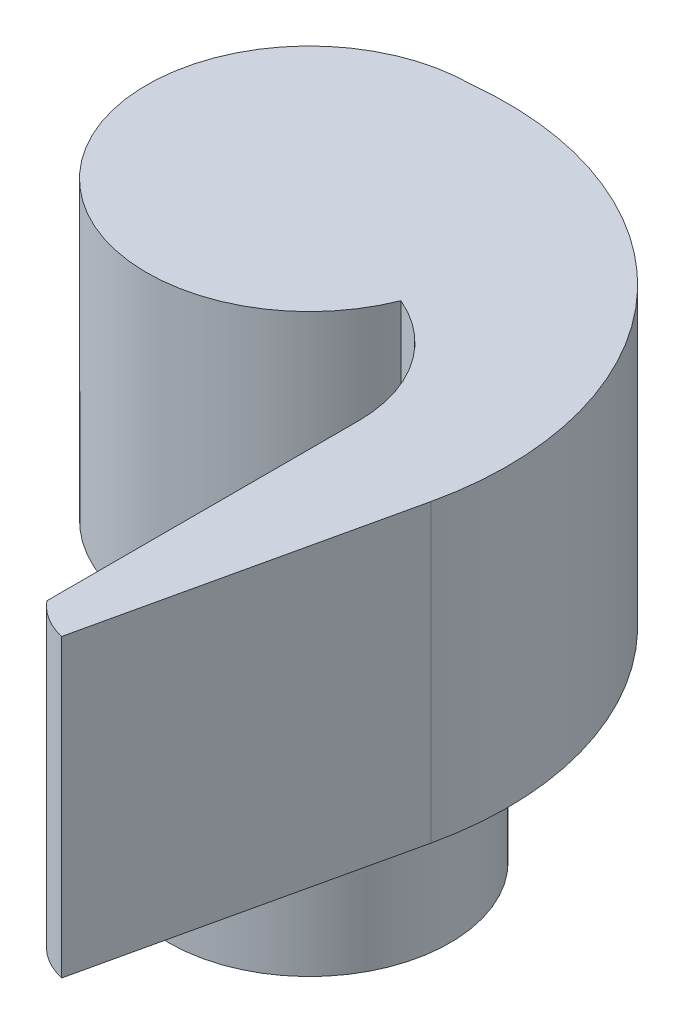
ISO-10303-21;
HEADER;
FILE_DESCRIPTION(('STEP AP214'),'2;1');
FILE_NAME('part.step','',(''),(''),'','','');
FILE_SCHEMA(('AUTOMOTIVE_DESIGN { 1 0 10303 214 1 1 1 1 }'));
ENDSEC;
DATA;
#1=APPLICATION_CONTEXT('core data for automotive mechanical design processes');
#2=APPLICATION_PROTOCOL_DEFINITION('international standard','automotive_design',2000,#1);
#3=PRODUCT_CONTEXT('',#1,'mechanical');
#4=PRODUCT('Part','Part','',(#3));
#5=PRODUCT_RELATED_PRODUCT_CATEGORY('part','',(#4));
#6=PRODUCT_DEFINITION_FORMATION('','',#4);
#7=PRODUCT_DEFINITION_CONTEXT('part definition',#1,'design');
#8=PRODUCT_DEFINITION('design','',#6,#7);
#9=PRODUCT_DEFINITION_SHAPE('','',#8);
#10=(LENGTH_UNIT() NAMED_UNIT(*) SI_UNIT(.MILLI.,.METRE.));
#11=(NAMED_UNIT(*) PLANE_ANGLE_UNIT() SI_UNIT($,.RADIAN.));
#12=(NAMED_UNIT(*) SI_UNIT($,.STERADIAN.) SOLID_ANGLE_UNIT());
#13=UNCERTAINTY_MEASURE_WITH_UNIT(LENGTH_MEASURE(1.E-05),#10,'distance_accuracy_value','');
#14=(GEOMETRIC_REPRESENTATION_CONTEXT(3) GLOBAL_UNCERTAINTY_ASSIGNED_CONTEXT((#13)) GLOBAL_UNIT_ASSIGNED_CONTEXT((#10,
#11,#12)) REPRESENTATION_CONTEXT('',''));
#15=CARTESIAN_POINT('',(0.,0.,0.));
#16=DIRECTION('',(0.,0.,1.));
#17=DIRECTION('',(1.,0.,0.));
#18=AXIS2_PLACEMENT_3D('',#15,#16,#17);
#19=CARTESIAN_POINT('',(19.4578777462422,20.,30.5814100525998));
#20=DIRECTION('',(0.,-1.,0.));
#21=DIRECTION('',(0.,0.,-1.));
#22=AXIS2_PLACEMENT_3D('',#19,#20,#21);
#23=CYLINDRICAL_SURFACE('',#22,4.71068136707812);
#24=CARTESIAN_POINT('',(19.4578777462422,0.,30.5814100525998));
#25=DIRECTION('',(0.,1.,0.));
#26=DIRECTION('',(0.,0.,-1.));
#27=AXIS2_PLACEMENT_3D('',#24,#25,#26);
#28=CIRCLE('',#27,4.71068136707812);
#29=CARTESIAN_POINT('',(15.8330571777441,0.,33.589930417884));
#30=VERTEX_POINT('',#29);
#31=CARTESIAN_POINT('',(18.4245412724948,0.,35.177357688742));
#32=VERTEX_POINT('',#31);
#33=EDGE_CURVE('E128',#30,#32,#28,.T.);
#34=ORIENTED_EDGE('',*,*,#33,.T.);
#35=DIRECTION('',(0.,-1.,0.));
#36=VECTOR('',#35,1.);
#37=CARTESIAN_POINT('',(18.4245412724948,20.,35.177357688742));
#38=LINE('',#37,#36);
#39=CARTESIAN_POINT('',(18.4245412724948,20.,35.177357688742));
#40=VERTEX_POINT('',#39);
#41=EDGE_CURVE('E11',#40,#32,#38,.T.);
#42=ORIENTED_EDGE('',*,*,#41,.F.);
#43=CARTESIAN_POINT('',(19.4578777462422,20.,30.5814100525998));
#44=DIRECTION('',(0.,1.,0.));
#45=DIRECTION('',(0.,0.,-1.));
#46=AXIS2_PLACEMENT_3D('',#43,#44,#45);
#47=CIRCLE('',#46,4.71068136707812);
#48=CARTESIAN_POINT('',(15.8330571777441,20.,33.589930417884));
#49=VERTEX_POINT('',#48);
#50=EDGE_CURVE('E145',#49,#40,#47,.T.);
#51=ORIENTED_EDGE('',*,*,#50,.F.);
#52=DIRECTION('',(0.,-1.,0.));
#53=VECTOR('',#52,1.);
#54=CARTESIAN_POINT('',(15.8330571777441,20.,33.589930417884));
#55=LINE('',#54,#53);
#56=EDGE_CURVE('E124',#49,#30,#55,.T.);
#57=ORIENTED_EDGE('',*,*,#56,.T.);
#58=EDGE_LOOP('',(#34,#42,#51,#57));
#59=FACE_BOUND('',#58,.T.);
#60=ADVANCED_FACE('F39',(#59),#23,.T.);
#61=CARTESIAN_POINT('',(18.4245412724948,20.,35.177357688742));
#62=DIRECTION('',(-0.975643920274919,0.,-0.219360299121303));
#63=DIRECTION('',(-0.219360299121303,0.,0.975643920274919));
#64=AXIS2_PLACEMENT_3D('',#61,#62,#63);
#65=PLANE('',#64);
#66=DIRECTION('',(0.219360299121303,0.,-0.975643920274919));
#67=VECTOR('',#66,1.);
#68=CARTESIAN_POINT('',(18.4245412724948,0.,35.177357688742));
#69=LINE('',#68,#67);
#70=CARTESIAN_POINT('',(23.0059943177965,0.,14.8005309448931));
#71=VERTEX_POINT('',#70);
#72=EDGE_CURVE('E132',#32,#71,#69,.T.);
#73=ORIENTED_EDGE('',*,*,#72,.T.);
#74=DIRECTION('',(0.,-1.,0.));
#75=VECTOR('',#74,1.);
#76=CARTESIAN_POINT('',(23.0059943177965,20.,14.8005309448931));
#77=LINE('',#76,#75);
#78=CARTESIAN_POINT('',(23.0059943177965,20.,14.8005309448931));
#79=VERTEX_POINT('',#78);
#80=EDGE_CURVE('E48',#79,#71,#77,.T.);
#81=ORIENTED_EDGE('',*,*,#80,.F.);
#82=DIRECTION('',(0.219360299121303,0.,-0.975643920274919));
#83=VECTOR('',#82,1.);
#84=CARTESIAN_POINT('',(18.4245412724948,20.,35.177357688742));
#85=LINE('',#84,#83);
#86=EDGE_CURVE('E93',#40,#79,#85,.T.);
#87=ORIENTED_EDGE('',*,*,#86,.F.);
#88=ORIENTED_EDGE('',*,*,#41,.T.);
#89=EDGE_LOOP('',(#73,#81,#87,#88));
#90=FACE_BOUND('',#89,.T.);
#91=ADVANCED_FACE('F173',(#90),#65,.F.);
#92=CARTESIAN_POINT('',(2.26541768259489,20.,10.1372936714378));
#93=DIRECTION('',(0.,-1.,0.));
#94=DIRECTION('',(0.,0.,-1.));
#95=AXIS2_PLACEMENT_3D('',#92,#93,#94);
#96=CYLINDRICAL_SURFACE('',#95,21.2583466203093);
#97=CARTESIAN_POINT('',(2.26541768259489,0.,10.1372936714378));
#98=DIRECTION('',(0.,1.,0.));
#99=DIRECTION('',(0.,0.,1.));
#100=AXIS2_PLACEMENT_3D('',#97,#98,#99);
#101=CIRCLE('',#100,21.2583466203093);
#102=CARTESIAN_POINT('',(0.,0.,-11.));
#103=VERTEX_POINT('',#102);
#104=EDGE_CURVE('E136',#71,#103,#101,.T.);
#105=ORIENTED_EDGE('',*,*,#104,.T.);
#106=DIRECTION('',(0.,-1.,0.));
#107=VECTOR('',#106,1.);
#108=CARTESIAN_POINT('',(0.,20.,-11.));
#109=LINE('',#108,#107);
#110=CARTESIAN_POINT('',(0.,20.,-11.));
#111=VERTEX_POINT('',#110);
#112=EDGE_CURVE('E117',#111,#103,#109,.T.);
#113=ORIENTED_EDGE('',*,*,#112,.F.);
#114=CARTESIAN_POINT('',(2.26541768259489,20.,10.1372936714378));
#115=DIRECTION('',(0.,1.,0.));
#116=DIRECTION('',(0.,0.,1.));
#117=AXIS2_PLACEMENT_3D('',#114,#115,#116);
#118=CIRCLE('',#117,21.2583466203093);
#119=EDGE_CURVE('E106',#79,#111,#118,.T.);
#120=ORIENTED_EDGE('',*,*,#119,.F.);
#121=ORIENTED_EDGE('',*,*,#80,.T.);
#122=EDGE_LOOP('',(#105,#113,#120,#121));
#123=FACE_BOUND('',#122,.T.);
#124=ADVANCED_FACE('F155',(#123),#96,.T.);
#125=CARTESIAN_POINT('',(0.,20.,0.));
#126=DIRECTION('',(0.,-1.,0.));
#127=DIRECTION('',(0.,0.,-1.));
#128=AXIS2_PLACEMENT_3D('',#125,#126,#127);
#129=CYLINDRICAL_SURFACE('',#128,11.);
#130=CARTESIAN_POINT('',(0.,0.,0.));
#131=DIRECTION('',(0.,1.,0.));
#132=DIRECTION('',(0.,0.,1.));
#133=AXIS2_PLACEMENT_3D('',#130,#131,#132);
#134=CIRCLE('',#133,11.);
#135=CARTESIAN_POINT('',(10.2278698948714,0.,4.04854015832654));
#136=VERTEX_POINT('',#135);
#137=EDGE_CURVE('E115',#103,#136,#134,.T.);
#138=ORIENTED_EDGE('',*,*,#137,.T.);
#139=DIRECTION('',(0.,-1.,0.));
#140=VECTOR('',#139,1.);
#141=CARTESIAN_POINT('',(10.2278698948714,20.,4.04854015832654));
#142=LINE('',#141,#140);
#143=CARTESIAN_POINT('',(10.2278698948714,20.,4.04854015832654));
#144=VERTEX_POINT('',#143);
#145=EDGE_CURVE('E112',#144,#136,#142,.T.);
#146=ORIENTED_EDGE('',*,*,#145,.F.);
#147=CARTESIAN_POINT('',(0.,20.,0.));
#148=DIRECTION('',(0.,1.,0.));
#149=DIRECTION('',(0.,0.,1.));
#150=AXIS2_PLACEMENT_3D('',#147,#148,#149);
#151=CIRCLE('',#150,11.);
#152=EDGE_CURVE('E100',#111,#144,#151,.T.);
#153=ORIENTED_EDGE('',*,*,#152,.F.);
#154=ORIENTED_EDGE('',*,*,#112,.T.);
#155=EDGE_LOOP('',(#138,#146,#153,#154));
#156=FACE_BOUND('',#155,.T.);
#157=ADVANCED_FACE('F113',(#156),#129,.T.);
#158=CARTESIAN_POINT('',(6.67701045397746,20.,12.4880063048794));
#159=DIRECTION('',(0.,-1.,0.));
#160=DIRECTION('',(0.,0.,-1.));
#161=AXIS2_PLACEMENT_3D('',#158,#159,#160);
#162=CYLINDRICAL_SURFACE('',#161,9.15604672376662);
#163=CARTESIAN_POINT('',(6.67701045397746,0.,12.4880063048794));
#164=DIRECTION('',(0.,-1.,0.));
#165=DIRECTION('',(0.,0.,1.));
#166=AXIS2_PLACEMENT_3D('',#163,#164,#165);
#167=CIRCLE('',#166,9.15604672376662);
#168=CARTESIAN_POINT('',(15.8330571777441,0.,12.4880063048794));
#169=VERTEX_POINT('',#168);
#170=EDGE_CURVE('E79',#136,#169,#167,.T.);
#171=ORIENTED_EDGE('',*,*,#170,.T.);
#172=DIRECTION('',(0.,-1.,0.));
#173=VECTOR('',#172,1.);
#174=CARTESIAN_POINT('',(15.8330571777441,20.,12.4880063048794));
#175=LINE('',#174,#173);
#176=CARTESIAN_POINT('',(15.8330571777441,20.,12.4880063048794));
#177=VERTEX_POINT('',#176);
#178=EDGE_CURVE('E118',#177,#169,#175,.T.);
#179=ORIENTED_EDGE('',*,*,#178,.F.);
#180=CARTESIAN_POINT('',(6.67701045397746,20.,12.4880063048794));
#181=DIRECTION('',(0.,-1.,0.));
#182=DIRECTION('',(0.,0.,1.));
#183=AXIS2_PLACEMENT_3D('',#180,#181,#182);
#184=CIRCLE('',#183,9.15604672376662);
#185=EDGE_CURVE('E104',#144,#177,#184,.T.);
#186=ORIENTED_EDGE('',*,*,#185,.F.);
#187=ORIENTED_EDGE('',*,*,#145,.T.);
#188=EDGE_LOOP('',(#171,#179,#186,#187));
#189=FACE_BOUND('',#188,.T.);
#190=ADVANCED_FACE('F120',(#189),#162,.F.);
#191=CARTESIAN_POINT('',(15.8330571777441,20.,33.589930417884));
#192=DIRECTION('',(1.,0.,0.));
#193=DIRECTION('',(0.,0.,-1.));
#194=AXIS2_PLACEMENT_3D('',#191,#192,#193);
#195=PLANE('',#194);
#196=DIRECTION('',(0.,0.,1.));
#197=VECTOR('',#196,1.);
#198=CARTESIAN_POINT('',(15.8330571777441,0.,33.589930417884));
#199=LINE('',#198,#197);
#200=EDGE_CURVE('E85',#169,#30,#199,.T.);
#201=ORIENTED_EDGE('',*,*,#200,.T.);
#202=ORIENTED_EDGE('',*,*,#56,.F.);
#203=DIRECTION('',(0.,0.,1.));
#204=VECTOR('',#203,1.);
#205=CARTESIAN_POINT('',(15.8330571777441,20.,33.589930417884));
#206=LINE('',#205,#204);
#207=EDGE_CURVE('E56',#177,#49,#206,.T.);
#208=ORIENTED_EDGE('',*,*,#207,.F.);
#209=ORIENTED_EDGE('',*,*,#178,.T.);
#210=EDGE_LOOP('',(#201,#202,#208,#209));
#211=FACE_BOUND('',#210,.T.);
#212=ADVANCED_FACE('F162',(#211),#195,.F.);
#213=CARTESIAN_POINT('',(19.4578777462422,20.,30.5814100525998));
#214=DIRECTION('',(0.,-1.,0.));
#215=DIRECTION('',(0.,0.,-1.));
#216=AXIS2_PLACEMENT_3D('',#213,#214,#215);
#217=PLANE('',#216);
#218=ORIENTED_EDGE('',*,*,#50,.T.);
#219=ORIENTED_EDGE('',*,*,#86,.T.);
#220=ORIENTED_EDGE('',*,*,#119,.T.);
#221=ORIENTED_EDGE('',*,*,#152,.T.);
#222=ORIENTED_EDGE('',*,*,#185,.T.);
#223=ORIENTED_EDGE('',*,*,#207,.T.);
#224=EDGE_LOOP('',(#218,#219,#220,#221,#222,#223));
#225=FACE_BOUND('',#224,.T.);
#226=ADVANCED_FACE('F102',(#225),#217,.F.);
#227=CARTESIAN_POINT('',(19.4578777462422,0.,30.5814100525998));
#228=DIRECTION('',(0.,-1.,0.));
#229=DIRECTION('',(0.,0.,-1.));
#230=AXIS2_PLACEMENT_3D('',#227,#228,#229);
#231=PLANE('',#230);
#232=CARTESIAN_POINT('',(0.,0.,0.));
#233=DIRECTION('',(0.,-1.,0.));
#234=DIRECTION('',(0.,0.,-1.));
#235=AXIS2_PLACEMENT_3D('',#232,#233,#234);
#236=CIRCLE('',#235,9.5);
#237=CARTESIAN_POINT('',(0.,0.,-9.5));
#238=VERTEX_POINT('',#237);
#239=EDGE_CURVE('E236',#238,#238,#236,.T.);
#240=ORIENTED_EDGE('',*,*,#239,.F.);
#241=EDGE_LOOP('',(#240));
#242=FACE_BOUND('',#241,.T.);
#243=ORIENTED_EDGE('',*,*,#33,.F.);
#244=ORIENTED_EDGE('',*,*,#200,.F.);
#245=ORIENTED_EDGE('',*,*,#170,.F.);
#246=ORIENTED_EDGE('',*,*,#137,.F.);
#247=ORIENTED_EDGE('',*,*,#104,.F.);
#248=ORIENTED_EDGE('',*,*,#72,.F.);
#249=EDGE_LOOP('',(#243,#244,#245,#246,#247,#248));
#250=FACE_BOUND('',#249,.T.);
#251=ADVANCED_FACE('F158',(#242,#250),#231,.T.);
#252=CARTESIAN_POINT('',(0.,-20.,0.));
#253=DIRECTION('',(0.,1.,0.));
#254=DIRECTION('',(0.,0.,1.));
#255=AXIS2_PLACEMENT_3D('',#252,#253,#254);
#256=CYLINDRICAL_SURFACE('',#255,9.5);
#257=CARTESIAN_POINT('',(0.,-20.,0.));
#258=DIRECTION('',(0.,-1.,0.));
#259=DIRECTION('',(0.,0.,-1.));
#260=AXIS2_PLACEMENT_3D('',#257,#258,#259);
#261=CIRCLE('',#260,9.5);
#262=CARTESIAN_POINT('',(0.,-20.,-9.5));
#263=VERTEX_POINT('',#262);
#264=EDGE_CURVE('E133',#263,#263,#261,.T.);
#265=ORIENTED_EDGE('',*,*,#264,.F.);
#266=EDGE_LOOP('',(#265));
#267=FACE_BOUND('',#266,.T.);
#268=ORIENTED_EDGE('',*,*,#239,.T.);
#269=EDGE_LOOP('',(#268));
#270=FACE_BOUND('',#269,.T.);
#271=ADVANCED_FACE('F210',(#267,#270),#256,.T.);
#272=CARTESIAN_POINT('',(0.,-20.,0.));
#273=DIRECTION('',(0.,-1.,0.));
#274=DIRECTION('',(0.,0.,-1.));
#275=AXIS2_PLACEMENT_3D('',#272,#273,#274);
#276=PLANE('',#275);
#277=ORIENTED_EDGE('',*,*,#264,.T.);
#278=EDGE_LOOP('',(#277));
#279=FACE_BOUND('',#278,.T.);
#280=ADVANCED_FACE('F219',(#279),#276,.T.);
#281=CLOSED_SHELL('',(#60,#91,#124,#157,#190,#212,#226,#251,#271,#280));
#282=MANIFOLD_SOLID_BREP('B2',#281);
#283=ADVANCED_BREP_SHAPE_REPRESENTATION('',(#18,#282),#14);
#284=SHAPE_DEFINITION_REPRESENTATION(#9,#283);
ENDSEC;
END-ISO-10303-21;
